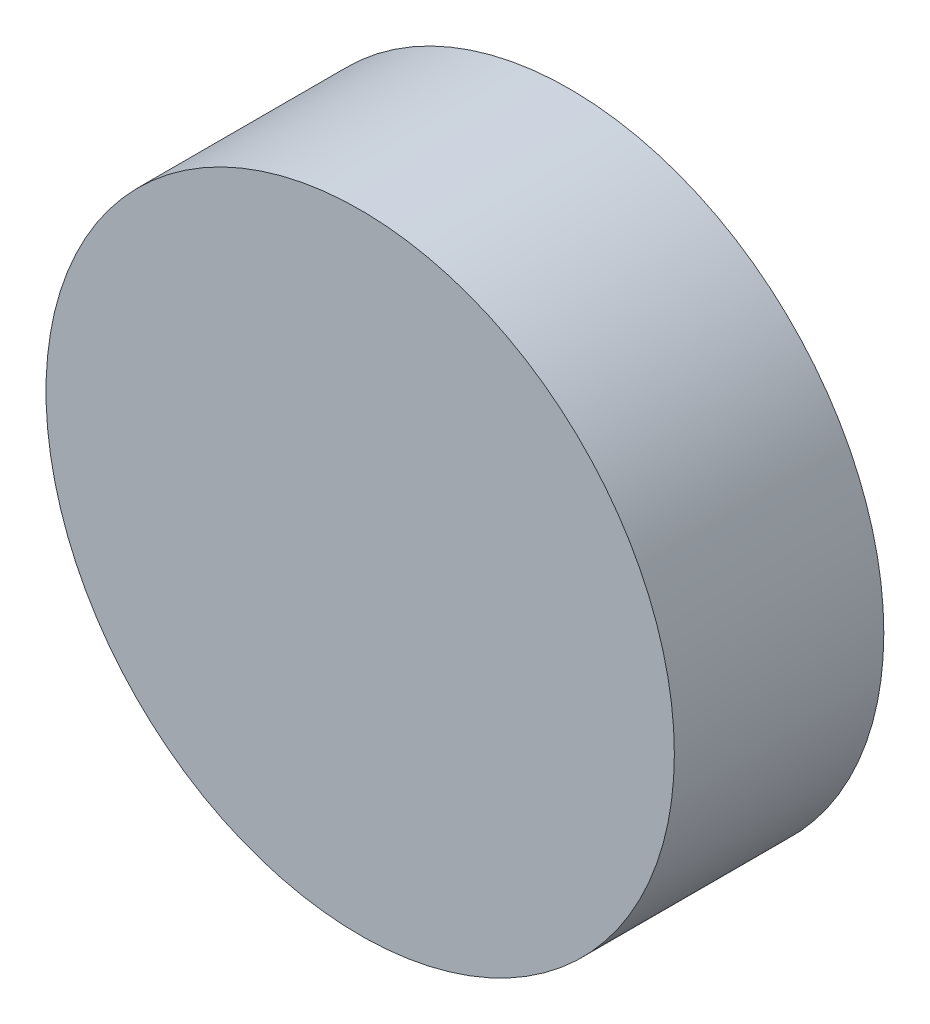
ISO-10303-21;
HEADER;
FILE_DESCRIPTION(('STEP AP214'),'2;1');
FILE_NAME('part.step','',(''),(''),'','','');
FILE_SCHEMA(('AUTOMOTIVE_DESIGN { 1 0 10303 214 1 1 1 1 }'));
ENDSEC;
DATA;
#1=APPLICATION_CONTEXT('core data for automotive mechanical design processes');
#2=APPLICATION_PROTOCOL_DEFINITION('international standard','automotive_design',2000,#1);
#3=PRODUCT_CONTEXT('',#1,'mechanical');
#4=PRODUCT('Part','Part','',(#3));
#5=PRODUCT_RELATED_PRODUCT_CATEGORY('part','',(#4));
#6=PRODUCT_DEFINITION_FORMATION('','',#4);
#7=PRODUCT_DEFINITION_CONTEXT('part definition',#1,'design');
#8=PRODUCT_DEFINITION('design','',#6,#7);
#9=PRODUCT_DEFINITION_SHAPE('','',#8);
#10=(LENGTH_UNIT() NAMED_UNIT(*) SI_UNIT(.MILLI.,.METRE.));
#11=(NAMED_UNIT(*) PLANE_ANGLE_UNIT() SI_UNIT($,.RADIAN.));
#12=(NAMED_UNIT(*) SI_UNIT($,.STERADIAN.) SOLID_ANGLE_UNIT());
#13=UNCERTAINTY_MEASURE_WITH_UNIT(LENGTH_MEASURE(1.E-05),#10,'distance_accuracy_value','');
#14=(GEOMETRIC_REPRESENTATION_CONTEXT(3) GLOBAL_UNCERTAINTY_ASSIGNED_CONTEXT((#13)) GLOBAL_UNIT_ASSIGNED_CONTEXT((#10,
#11,#12)) REPRESENTATION_CONTEXT('',''));
#15=CARTESIAN_POINT('',(0.,0.,0.));
#16=DIRECTION('',(0.,0.,1.));
#17=DIRECTION('',(1.,0.,0.));
#18=AXIS2_PLACEMENT_3D('',#15,#16,#17);
#19=CARTESIAN_POINT('',(0.,0.,50.));
#20=DIRECTION('',(0.,0.,-1.));
#21=DIRECTION('',(-1.,0.,0.));
#22=AXIS2_PLACEMENT_3D('',#19,#20,#21);
#23=CYLINDRICAL_SURFACE('',#22,75.);
#24=CARTESIAN_POINT('',(0.,0.,50.));
#25=DIRECTION('',(0.,0.,1.));
#26=DIRECTION('',(1.,0.,0.));
#27=AXIS2_PLACEMENT_3D('',#24,#25,#26);
#28=CIRCLE('',#27,75.);
#29=CARTESIAN_POINT('',(75.,0.,50.));
#30=VERTEX_POINT('',#29);
#31=EDGE_CURVE('E10',#30,#30,#28,.T.);
#32=ORIENTED_EDGE('',*,*,#31,.F.);
#33=EDGE_LOOP('',(#32));
#34=FACE_BOUND('',#33,.T.);
#35=CARTESIAN_POINT('',(0.,0.,0.));
#36=DIRECTION('',(0.,0.,1.));
#37=DIRECTION('',(1.,0.,0.));
#38=AXIS2_PLACEMENT_3D('',#35,#36,#37);
#39=CIRCLE('',#38,75.);
#40=CARTESIAN_POINT('',(75.,0.,0.));
#41=VERTEX_POINT('',#40);
#42=EDGE_CURVE('E37',#41,#41,#39,.T.);
#43=ORIENTED_EDGE('',*,*,#42,.T.);
#44=EDGE_LOOP('',(#43));
#45=FACE_BOUND('',#44,.T.);
#46=ADVANCED_FACE('F40',(#34,#45),#23,.T.);
#47=CARTESIAN_POINT('',(0.,0.,50.));
#48=DIRECTION('',(0.,0.,1.));
#49=DIRECTION('',(1.,0.,0.));
#50=AXIS2_PLACEMENT_3D('',#47,#48,#49);
#51=PLANE('',#50);
#52=ORIENTED_EDGE('',*,*,#31,.T.);
#53=EDGE_LOOP('',(#52));
#54=FACE_BOUND('',#53,.T.);
#55=ADVANCED_FACE('F55',(#54),#51,.T.);
#56=CARTESIAN_POINT('',(0.,0.,0.));
#57=DIRECTION('',(0.,0.,1.));
#58=DIRECTION('',(1.,0.,0.));
#59=AXIS2_PLACEMENT_3D('',#56,#57,#58);
#60=PLANE('',#59);
#61=ORIENTED_EDGE('',*,*,#42,.F.);
#62=EDGE_LOOP('',(#61));
#63=FACE_BOUND('',#62,.T.);
#64=ADVANCED_FACE('F49',(#63),#60,.F.);
#65=CLOSED_SHELL('',(#46,#55,#64));
#66=MANIFOLD_SOLID_BREP('B2',#65);
#67=ADVANCED_BREP_SHAPE_REPRESENTATION('',(#18,#66),#14);
#68=SHAPE_DEFINITION_REPRESENTATION(#9,#67);
ENDSEC;
END-ISO-10303-21;
